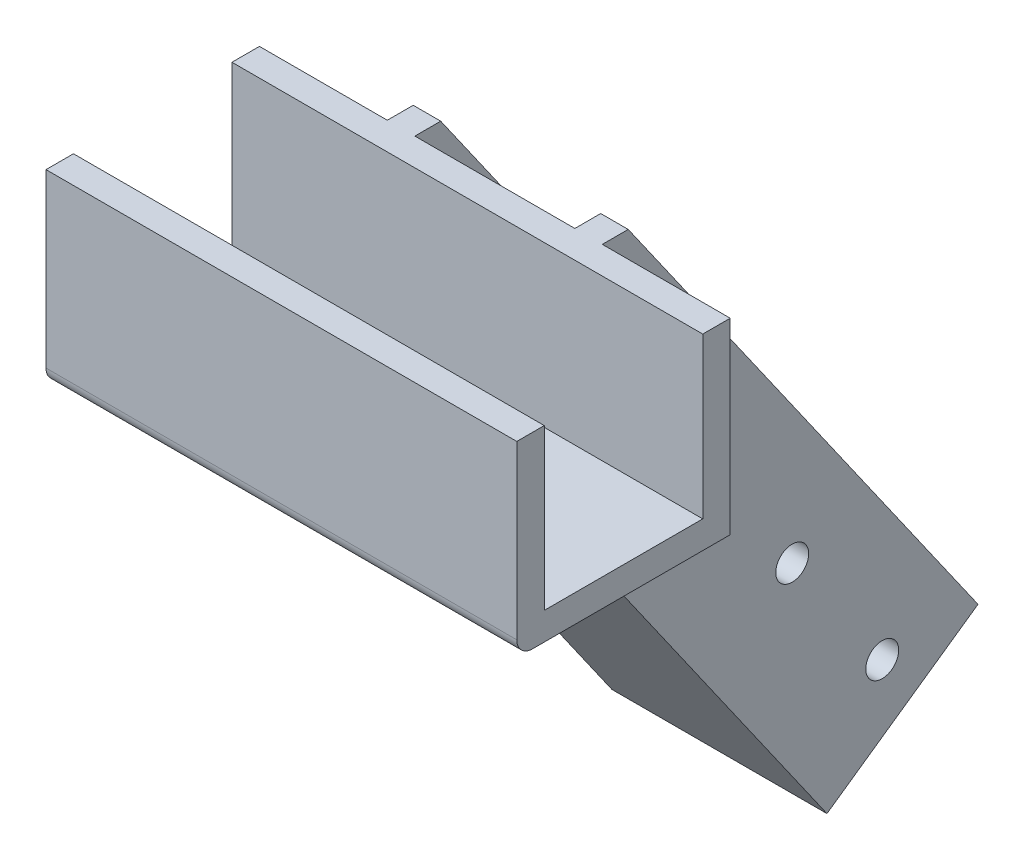
ISO-10303-21;
HEADER;
FILE_DESCRIPTION(('STEP AP214'),'2;1');
FILE_NAME('part.step','',(''),(''),'','','');
FILE_SCHEMA(('AUTOMOTIVE_DESIGN { 1 0 10303 214 1 1 1 1 }'));
ENDSEC;
DATA;
#1=APPLICATION_CONTEXT('core data for automotive mechanical design processes');
#2=APPLICATION_PROTOCOL_DEFINITION('international standard','automotive_design',2000,#1);
#3=PRODUCT_CONTEXT('',#1,'mechanical');
#4=PRODUCT('Part','Part','',(#3));
#5=PRODUCT_RELATED_PRODUCT_CATEGORY('part','',(#4));
#6=PRODUCT_DEFINITION_FORMATION('','',#4);
#7=PRODUCT_DEFINITION_CONTEXT('part definition',#1,'design');
#8=PRODUCT_DEFINITION('design','',#6,#7);
#9=PRODUCT_DEFINITION_SHAPE('','',#8);
#10=(LENGTH_UNIT() NAMED_UNIT(*) SI_UNIT(.MILLI.,.METRE.));
#11=(NAMED_UNIT(*) PLANE_ANGLE_UNIT() SI_UNIT($,.RADIAN.));
#12=(NAMED_UNIT(*) SI_UNIT($,.STERADIAN.) SOLID_ANGLE_UNIT());
#13=UNCERTAINTY_MEASURE_WITH_UNIT(LENGTH_MEASURE(1.E-05),#10,'distance_accuracy_value','');
#14=(GEOMETRIC_REPRESENTATION_CONTEXT(3) GLOBAL_UNCERTAINTY_ASSIGNED_CONTEXT((#13)) GLOBAL_UNIT_ASSIGNED_CONTEXT((#10,
#11,#12)) REPRESENTATION_CONTEXT('',''));
#15=CARTESIAN_POINT('',(0.,0.,0.));
#16=DIRECTION('',(0.,0.,1.));
#17=DIRECTION('',(1.,0.,0.));
#18=AXIS2_PLACEMENT_3D('',#15,#16,#17);
#19=CARTESIAN_POINT('',(13.7,-51.7158366245348,-61.4792987336094));
#20=DIRECTION('',(0.,-0.573576436351047,0.819152044288991));
#21=DIRECTION('',(0.,-0.819152044288991,-0.573576436351047));
#22=AXIS2_PLACEMENT_3D('',#19,#20,#21);
#23=PLANE('',#22);
#24=DIRECTION('',(0.,0.819152044288991,0.573576436351047));
#25=VECTOR('',#24,1.);
#26=CARTESIAN_POINT('',(-13.7,-51.7158366245348,-61.4792987336094));
#27=LINE('',#26,#25);
#28=CARTESIAN_POINT('',(-13.7,-51.7158366245348,-61.4792987336094));
#29=VERTEX_POINT('',#28);
#30=CARTESIAN_POINT('',(-13.7,11.95,-16.9000000026822));
#31=VERTEX_POINT('',#30);
#32=EDGE_CURVE('E197',#29,#31,#27,.T.);
#33=ORIENTED_EDGE('',*,*,#32,.T.);
#34=DIRECTION('',(1.,0.,0.));
#35=VECTOR('',#34,1.);
#36=CARTESIAN_POINT('',(13.7,11.95,-16.9000000026822));
#37=LINE('',#36,#35);
#38=CARTESIAN_POINT('',(-10.1946127968211,11.95,-16.9000000026822));
#39=VERTEX_POINT('',#38);
#40=EDGE_CURVE('E180',#31,#39,#37,.T.);
#41=ORIENTED_EDGE('',*,*,#40,.T.);
#42=DIRECTION('',(0.,0.819152044288991,0.573576436351047));
#43=VECTOR('',#42,1.);
#44=CARTESIAN_POINT('',(-10.1946127968211,-51.7158366245348,-61.4792987336094));
#45=LINE('',#44,#43);
#46=CARTESIAN_POINT('',(-10.1946127968211,-51.7158366245348,-61.4792987336094));
#47=VERTEX_POINT('',#46);
#48=EDGE_CURVE('E352',#47,#39,#45,.T.);
#49=ORIENTED_EDGE('',*,*,#48,.F.);
#50=DIRECTION('',(-1.,0.,0.));
#51=VECTOR('',#50,1.);
#52=CARTESIAN_POINT('',(13.7,-51.7158366245348,-61.4792987336094));
#53=LINE('',#52,#51);
#54=EDGE_CURVE('E204',#47,#29,#53,.T.);
#55=ORIENTED_EDGE('',*,*,#54,.T.);
#56=EDGE_LOOP('',(#33,#41,#49,#55));
#57=FACE_BOUND('',#56,.T.);
#58=ADVANCED_FACE('F33',(#57),#23,.F.);
#59=CARTESIAN_POINT('',(13.7,-65.1948828787844,-42.2292256928181));
#60=DIRECTION('',(0.,0.819152044288991,0.573576436351047));
#61=DIRECTION('',(0.,-0.573576436351047,0.819152044288991));
#62=AXIS2_PLACEMENT_3D('',#59,#60,#61);
#63=PLANE('',#62);
#64=DIRECTION('',(0.,0.573576436351047,-0.819152044288991));
#65=VECTOR('',#64,1.);
#66=CARTESIAN_POINT('',(-10.1946127968211,-65.1948828787844,-42.2292256928181));
#67=LINE('',#66,#65);
#68=CARTESIAN_POINT('',(-10.1946127968211,-63.1842753787545,-45.1006707863266));
#69=VERTEX_POINT('',#68);
#70=EDGE_CURVE('E355',#69,#47,#67,.T.);
#71=ORIENTED_EDGE('',*,*,#70,.F.);
#72=DIRECTION('',(-1.,0.,0.));
#73=VECTOR('',#72,1.);
#74=CARTESIAN_POINT('',(13.7,-63.1842753787545,-45.1006707863266));
#75=LINE('',#74,#73);
#76=CARTESIAN_POINT('',(10.1946127968211,-63.1842753787545,-45.1006707863266));
#77=VERTEX_POINT('',#76);
#78=EDGE_CURVE('E358',#77,#69,#75,.T.);
#79=ORIENTED_EDGE('',*,*,#78,.F.);
#80=DIRECTION('',(0.,0.573576436351047,-0.819152044288991));
#81=VECTOR('',#80,1.);
#82=CARTESIAN_POINT('',(10.1946127968211,-65.1948828787844,-42.2292256928181));
#83=LINE('',#82,#81);
#84=CARTESIAN_POINT('',(10.1946127968211,-51.7158366245348,-61.4792987336094));
#85=VERTEX_POINT('',#84);
#86=EDGE_CURVE('E344',#77,#85,#83,.T.);
#87=ORIENTED_EDGE('',*,*,#86,.T.);
#88=CARTESIAN_POINT('',(13.7,-51.7158366245348,-61.4792987336094));
#89=VERTEX_POINT('',#88);
#90=EDGE_CURVE('E214',#89,#85,#53,.T.);
#91=ORIENTED_EDGE('',*,*,#90,.F.);
#92=DIRECTION('',(0.,0.573576436351047,-0.819152044288991));
#93=VECTOR('',#92,1.);
#94=CARTESIAN_POINT('',(13.7,-65.1948828787844,-42.2292256928181));
#95=LINE('',#94,#93);
#96=CARTESIAN_POINT('',(13.7,-65.1948828787844,-42.2292256928181));
#97=VERTEX_POINT('',#96);
#98=EDGE_CURVE('E324',#97,#89,#95,.T.);
#99=ORIENTED_EDGE('',*,*,#98,.F.);
#100=DIRECTION('',(-1.,0.,0.));
#101=VECTOR('',#100,1.);
#102=CARTESIAN_POINT('',(13.7,-65.1948828787844,-42.2292256928181));
#103=LINE('',#102,#101);
#104=CARTESIAN_POINT('',(-13.7,-65.1948828787844,-42.2292256928181));
#105=VERTEX_POINT('',#104);
#106=EDGE_CURVE('E217',#97,#105,#103,.T.);
#107=ORIENTED_EDGE('',*,*,#106,.T.);
#108=DIRECTION('',(0.,0.573576436351047,-0.819152044288991));
#109=VECTOR('',#108,1.);
#110=CARTESIAN_POINT('',(-13.7,-65.1948828787844,-42.2292256928181));
#111=LINE('',#110,#109);
#112=EDGE_CURVE('E206',#105,#29,#111,.T.);
#113=ORIENTED_EDGE('',*,*,#112,.T.);
#114=ORIENTED_EDGE('',*,*,#54,.F.);
#115=EDGE_LOOP('',(#71,#79,#87,#91,#99,#107,#113,#114));
#116=FACE_BOUND('',#115,.T.);
#117=ADVANCED_FACE('F424',(#116),#63,.F.);
#118=DIRECTION('',(0.,0.819152044288991,0.573576436351047));
#119=VECTOR('',#118,1.);
#120=CARTESIAN_POINT('',(10.1946127968211,-51.7158366245348,-61.4792987336094));
#121=LINE('',#120,#119);
#122=CARTESIAN_POINT('',(10.1946127968211,11.95,-16.9000000026822));
#123=VERTEX_POINT('',#122);
#124=EDGE_CURVE('E347',#85,#123,#121,.T.);
#125=ORIENTED_EDGE('',*,*,#124,.T.);
#126=CARTESIAN_POINT('',(13.7,11.95,-16.9000000026822));
#127=VERTEX_POINT('',#126);
#128=EDGE_CURVE('E192',#123,#127,#37,.T.);
#129=ORIENTED_EDGE('',*,*,#128,.T.);
#130=DIRECTION('',(0.,0.819152044288991,0.573576436351047));
#131=VECTOR('',#130,1.);
#132=CARTESIAN_POINT('',(13.7,-51.7158366245348,-61.4792987336094));
#133=LINE('',#132,#131);
#134=EDGE_CURVE('E331',#89,#127,#133,.T.);
#135=ORIENTED_EDGE('',*,*,#134,.F.);
#136=ORIENTED_EDGE('',*,*,#90,.T.);
#137=EDGE_LOOP('',(#125,#129,#135,#136));
#138=FACE_BOUND('',#137,.T.);
#139=ADVANCED_FACE('F426',(#138),#23,.F.);
#140=CARTESIAN_POINT('',(30.,-11.95,-13.6));
#141=DIRECTION('',(0.,0.,1.));
#142=DIRECTION('',(1.,0.,0.));
#143=AXIS2_PLACEMENT_3D('',#140,#141,#142);
#144=PLANE('',#143);
#145=DIRECTION('',(0.,-1.,0.));
#146=VECTOR('',#145,1.);
#147=CARTESIAN_POINT('',(-13.7,-11.95,-13.6));
#148=LINE('',#147,#146);
#149=CARTESIAN_POINT('',(-13.7,11.95,-13.6));
#150=VERTEX_POINT('',#149);
#151=CARTESIAN_POINT('',(-13.7,-11.95,-13.6));
#152=VERTEX_POINT('',#151);
#153=EDGE_CURVE('E199',#150,#152,#148,.T.);
#154=ORIENTED_EDGE('',*,*,#153,.T.);
#155=DIRECTION('',(-1.,0.,0.));
#156=VECTOR('',#155,1.);
#157=CARTESIAN_POINT('',(30.,-11.95,-13.6));
#158=LINE('',#157,#156);
#159=CARTESIAN_POINT('',(-30.,-11.95,-13.6));
#160=VERTEX_POINT('',#159);
#161=EDGE_CURVE('E259',#152,#160,#158,.T.);
#162=ORIENTED_EDGE('',*,*,#161,.T.);
#163=DIRECTION('',(0.,1.,0.));
#164=VECTOR('',#163,1.);
#165=CARTESIAN_POINT('',(-30.,-11.95,-13.6));
#166=LINE('',#165,#164);
#167=CARTESIAN_POINT('',(-30.,11.95,-13.6));
#168=VERTEX_POINT('',#167);
#169=EDGE_CURVE('E245',#160,#168,#166,.T.);
#170=ORIENTED_EDGE('',*,*,#169,.T.);
#171=DIRECTION('',(-1.,0.,0.));
#172=VECTOR('',#171,1.);
#173=CARTESIAN_POINT('',(30.,11.95,-13.6));
#174=LINE('',#173,#172);
#175=EDGE_CURVE('E276',#150,#168,#174,.T.);
#176=ORIENTED_EDGE('',*,*,#175,.F.);
#177=EDGE_LOOP('',(#154,#162,#170,#176));
#178=FACE_BOUND('',#177,.T.);
#179=ADVANCED_FACE('F435',(#178),#144,.F.);
#180=CARTESIAN_POINT('',(30.,11.95,13.6));
#181=DIRECTION('',(0.,-1.,0.));
#182=DIRECTION('',(0.,0.,-1.));
#183=AXIS2_PLACEMENT_3D('',#180,#181,#182);
#184=PLANE('',#183);
#185=CARTESIAN_POINT('',(30.,11.95,-13.6));
#186=VERTEX_POINT('',#185);
#187=CARTESIAN_POINT('',(13.7,11.95,-13.6));
#188=VERTEX_POINT('',#187);
#189=EDGE_CURVE('E277',#186,#188,#174,.T.);
#190=ORIENTED_EDGE('',*,*,#189,.T.);
#191=DIRECTION('',(0.,0.,1.));
#192=VECTOR('',#191,1.);
#193=CARTESIAN_POINT('',(13.7,11.95,-61.4792987336094));
#194=LINE('',#193,#192);
#195=EDGE_CURVE('E201',#127,#188,#194,.T.);
#196=ORIENTED_EDGE('',*,*,#195,.F.);
#197=ORIENTED_EDGE('',*,*,#128,.F.);
#198=DIRECTION('',(0.,0.,-1.));
#199=VECTOR('',#198,1.);
#200=CARTESIAN_POINT('',(10.1946127968211,11.95,0.));
#201=LINE('',#200,#199);
#202=CARTESIAN_POINT('',(10.1946127968211,11.95,-13.6053872031789));
#203=VERTEX_POINT('',#202);
#204=EDGE_CURVE('E190',#203,#123,#201,.T.);
#205=ORIENTED_EDGE('',*,*,#204,.F.);
#206=DIRECTION('',(1.,0.,0.));
#207=VECTOR('',#206,1.);
#208=CARTESIAN_POINT('',(30.,11.95,-13.6053872031789));
#209=LINE('',#208,#207);
#210=CARTESIAN_POINT('',(-10.1946127968211,11.95,-13.6053872031789));
#211=VERTEX_POINT('',#210);
#212=EDGE_CURVE('E47',#211,#203,#209,.T.);
#213=ORIENTED_EDGE('',*,*,#212,.F.);
#214=DIRECTION('',(0.,0.,-1.));
#215=VECTOR('',#214,1.);
#216=CARTESIAN_POINT('',(-10.1946127968211,11.95,0.));
#217=LINE('',#216,#215);
#218=EDGE_CURVE('E11',#211,#39,#217,.T.);
#219=ORIENTED_EDGE('',*,*,#218,.T.);
#220=ORIENTED_EDGE('',*,*,#40,.F.);
#221=DIRECTION('',(0.,0.,1.));
#222=VECTOR('',#221,1.);
#223=CARTESIAN_POINT('',(-13.7,11.95,-61.4792987336094));
#224=LINE('',#223,#222);
#225=EDGE_CURVE('E184',#31,#150,#224,.T.);
#226=ORIENTED_EDGE('',*,*,#225,.T.);
#227=ORIENTED_EDGE('',*,*,#175,.T.);
#228=DIRECTION('',(0.,0.,1.));
#229=VECTOR('',#228,1.);
#230=CARTESIAN_POINT('',(-30.,11.95,13.6));
#231=LINE('',#230,#229);
#232=CARTESIAN_POINT('',(-30.,11.95,-10.1));
#233=VERTEX_POINT('',#232);
#234=EDGE_CURVE('E263',#168,#233,#231,.T.);
#235=ORIENTED_EDGE('',*,*,#234,.T.);
#236=DIRECTION('',(-1.,0.,0.));
#237=VECTOR('',#236,1.);
#238=CARTESIAN_POINT('',(30.,11.95,-10.1));
#239=LINE('',#238,#237);
#240=CARTESIAN_POINT('',(30.,11.95,-10.1));
#241=VERTEX_POINT('',#240);
#242=EDGE_CURVE('E239',#241,#233,#239,.T.);
#243=ORIENTED_EDGE('',*,*,#242,.F.);
#244=DIRECTION('',(0.,0.,1.));
#245=VECTOR('',#244,1.);
#246=CARTESIAN_POINT('',(30.,11.95,13.6));
#247=LINE('',#246,#245);
#248=EDGE_CURVE('E251',#186,#241,#247,.T.);
#249=ORIENTED_EDGE('',*,*,#248,.F.);
#250=EDGE_LOOP('',(#190,#196,#197,#205,#213,#219,#220,#226,#227,#235,#243,#249));
#251=FACE_BOUND('',#250,.T.);
#252=ADVANCED_FACE('F183',(#251),#184,.F.);
#253=CARTESIAN_POINT('',(30.,0.,0.));
#254=DIRECTION('',(-1.,0.,0.));
#255=DIRECTION('',(0.,0.,1.));
#256=AXIS2_PLACEMENT_3D('',#253,#254,#255);
#257=PLANE('',#256);
#258=DIRECTION('',(0.,-1.,0.));
#259=VECTOR('',#258,1.);
#260=CARTESIAN_POINT('',(30.,-11.95,13.6));
#261=LINE('',#260,#259);
#262=CARTESIAN_POINT('',(30.,11.95,13.6));
#263=VERTEX_POINT('',#262);
#264=CARTESIAN_POINT('',(30.,-9.95,13.6));
#265=VERTEX_POINT('',#264);
#266=EDGE_CURVE('E254',#263,#265,#261,.T.);
#267=ORIENTED_EDGE('',*,*,#266,.T.);
#268=CARTESIAN_POINT('',(30.,-9.95,11.6));
#269=DIRECTION('',(-1.,0.,0.));
#270=DIRECTION('',(0.,0.,1.));
#271=AXIS2_PLACEMENT_3D('',#268,#269,#270);
#272=CIRCLE('',#271,2.);
#273=CARTESIAN_POINT('',(30.,-11.95,11.6));
#274=VERTEX_POINT('',#273);
#275=EDGE_CURVE('E286',#265,#274,#272,.F.);
#276=ORIENTED_EDGE('',*,*,#275,.T.);
#277=DIRECTION('',(0.,0.,-1.));
#278=VECTOR('',#277,1.);
#279=CARTESIAN_POINT('',(30.,-11.95,13.6));
#280=LINE('',#279,#278);
#281=CARTESIAN_POINT('',(30.,-11.95,-13.6));
#282=VERTEX_POINT('',#281);
#283=EDGE_CURVE('E257',#274,#282,#280,.T.);
#284=ORIENTED_EDGE('',*,*,#283,.T.);
#285=DIRECTION('',(0.,1.,0.));
#286=VECTOR('',#285,1.);
#287=CARTESIAN_POINT('',(30.,-11.95,-13.6));
#288=LINE('',#287,#286);
#289=EDGE_CURVE('E246',#282,#186,#288,.T.);
#290=ORIENTED_EDGE('',*,*,#289,.T.);
#291=ORIENTED_EDGE('',*,*,#248,.T.);
#292=DIRECTION('',(0.,1.,0.));
#293=VECTOR('',#292,1.);
#294=CARTESIAN_POINT('',(30.,0.,-10.1));
#295=LINE('',#294,#293);
#296=CARTESIAN_POINT('',(30.,-8.45,-10.1));
#297=VERTEX_POINT('',#296);
#298=EDGE_CURVE('E234',#297,#241,#295,.T.);
#299=ORIENTED_EDGE('',*,*,#298,.F.);
#300=DIRECTION('',(0.,0.,-1.));
#301=VECTOR('',#300,1.);
#302=CARTESIAN_POINT('',(30.,-8.45,0.));
#303=LINE('',#302,#301);
#304=CARTESIAN_POINT('',(30.,-8.45,10.1));
#305=VERTEX_POINT('',#304);
#306=EDGE_CURVE('E224',#305,#297,#303,.T.);
#307=ORIENTED_EDGE('',*,*,#306,.F.);
#308=DIRECTION('',(0.,-1.,0.));
#309=VECTOR('',#308,1.);
#310=CARTESIAN_POINT('',(30.,0.,10.1));
#311=LINE('',#310,#309);
#312=CARTESIAN_POINT('',(30.,11.95,10.1));
#313=VERTEX_POINT('',#312);
#314=EDGE_CURVE('E240',#313,#305,#311,.T.);
#315=ORIENTED_EDGE('',*,*,#314,.F.);
#316=EDGE_CURVE('E249',#313,#263,#247,.T.);
#317=ORIENTED_EDGE('',*,*,#316,.T.);
#318=EDGE_LOOP('',(#267,#276,#284,#290,#291,#299,#307,#315,#317));
#319=FACE_BOUND('',#318,.T.);
#320=ADVANCED_FACE('F402',(#319),#257,.F.);
#321=CARTESIAN_POINT('',(-30.,0.,0.));
#322=DIRECTION('',(-1.,0.,0.));
#323=DIRECTION('',(0.,0.,1.));
#324=AXIS2_PLACEMENT_3D('',#321,#322,#323);
#325=PLANE('',#324);
#326=DIRECTION('',(0.,0.,-1.));
#327=VECTOR('',#326,1.);
#328=CARTESIAN_POINT('',(-30.,-11.95,13.6));
#329=LINE('',#328,#327);
#330=CARTESIAN_POINT('',(-30.,-11.95,11.6));
#331=VERTEX_POINT('',#330);
#332=EDGE_CURVE('E250',#331,#160,#329,.T.);
#333=ORIENTED_EDGE('',*,*,#332,.F.);
#334=CARTESIAN_POINT('',(-30.,-9.95,11.6));
#335=DIRECTION('',(-1.,0.,0.));
#336=DIRECTION('',(0.,0.,1.));
#337=AXIS2_PLACEMENT_3D('',#334,#335,#336);
#338=CIRCLE('',#337,2.);
#339=CARTESIAN_POINT('',(-30.,-9.95,13.6));
#340=VERTEX_POINT('',#339);
#341=EDGE_CURVE('E282',#331,#340,#338,.T.);
#342=ORIENTED_EDGE('',*,*,#341,.T.);
#343=DIRECTION('',(0.,-1.,0.));
#344=VECTOR('',#343,1.);
#345=CARTESIAN_POINT('',(-30.,-11.95,13.6));
#346=LINE('',#345,#344);
#347=CARTESIAN_POINT('',(-30.,11.95,13.6));
#348=VERTEX_POINT('',#347);
#349=EDGE_CURVE('E266',#348,#340,#346,.T.);
#350=ORIENTED_EDGE('',*,*,#349,.F.);
#351=CARTESIAN_POINT('',(-30.,11.95,10.1));
#352=VERTEX_POINT('',#351);
#353=EDGE_CURVE('E262',#352,#348,#231,.T.);
#354=ORIENTED_EDGE('',*,*,#353,.F.);
#355=DIRECTION('',(0.,-1.,0.));
#356=VECTOR('',#355,1.);
#357=CARTESIAN_POINT('',(-30.,0.,10.1));
#358=LINE('',#357,#356);
#359=CARTESIAN_POINT('',(-30.,-8.45,10.1));
#360=VERTEX_POINT('',#359);
#361=EDGE_CURVE('E230',#352,#360,#358,.T.);
#362=ORIENTED_EDGE('',*,*,#361,.T.);
#363=DIRECTION('',(0.,0.,-1.));
#364=VECTOR('',#363,1.);
#365=CARTESIAN_POINT('',(-30.,-8.45,0.));
#366=LINE('',#365,#364);
#367=CARTESIAN_POINT('',(-30.,-8.45,-10.1));
#368=VERTEX_POINT('',#367);
#369=EDGE_CURVE('E231',#360,#368,#366,.T.);
#370=ORIENTED_EDGE('',*,*,#369,.T.);
#371=DIRECTION('',(0.,1.,0.));
#372=VECTOR('',#371,1.);
#373=CARTESIAN_POINT('',(-30.,0.,-10.1));
#374=LINE('',#373,#372);
#375=EDGE_CURVE('E220',#368,#233,#374,.T.);
#376=ORIENTED_EDGE('',*,*,#375,.T.);
#377=ORIENTED_EDGE('',*,*,#234,.F.);
#378=ORIENTED_EDGE('',*,*,#169,.F.);
#379=EDGE_LOOP('',(#333,#342,#350,#354,#362,#370,#376,#377,#378));
#380=FACE_BOUND('',#379,.T.);
#381=ADVANCED_FACE('F577',(#380),#325,.T.);
#382=CARTESIAN_POINT('',(13.7,-11.95,-13.6));
#383=VERTEX_POINT('',#382);
#384=EDGE_CURVE('E270',#282,#383,#158,.T.);
#385=ORIENTED_EDGE('',*,*,#384,.T.);
#386=DIRECTION('',(0.,-1.,0.));
#387=VECTOR('',#386,1.);
#388=CARTESIAN_POINT('',(13.7,-11.95,-13.6));
#389=LINE('',#388,#387);
#390=EDGE_CURVE('E329',#188,#383,#389,.T.);
#391=ORIENTED_EDGE('',*,*,#390,.F.);
#392=ORIENTED_EDGE('',*,*,#189,.F.);
#393=ORIENTED_EDGE('',*,*,#289,.F.);
#394=EDGE_LOOP('',(#385,#391,#392,#393));
#395=FACE_BOUND('',#394,.T.);
#396=ADVANCED_FACE('F396',(#395),#144,.F.);
#397=ORIENTED_EDGE('',*,*,#316,.F.);
#398=DIRECTION('',(-1.,0.,0.));
#399=VECTOR('',#398,1.);
#400=CARTESIAN_POINT('',(30.,11.95,10.1));
#401=LINE('',#400,#399);
#402=EDGE_CURVE('E227',#313,#352,#401,.T.);
#403=ORIENTED_EDGE('',*,*,#402,.T.);
#404=ORIENTED_EDGE('',*,*,#353,.T.);
#405=DIRECTION('',(-1.,0.,0.));
#406=VECTOR('',#405,1.);
#407=CARTESIAN_POINT('',(30.,11.95,13.6));
#408=LINE('',#407,#406);
#409=EDGE_CURVE('E273',#263,#348,#408,.T.);
#410=ORIENTED_EDGE('',*,*,#409,.F.);
#411=EDGE_LOOP('',(#397,#403,#404,#410));
#412=FACE_BOUND('',#411,.T.);
#413=ADVANCED_FACE('F419',(#412),#184,.F.);
#414=CARTESIAN_POINT('',(30.,-11.95,13.6));
#415=DIRECTION('',(0.,0.,-1.));
#416=DIRECTION('',(-1.,0.,0.));
#417=AXIS2_PLACEMENT_3D('',#414,#415,#416);
#418=PLANE('',#417);
#419=ORIENTED_EDGE('',*,*,#349,.T.);
#420=DIRECTION('',(-1.,0.,0.));
#421=VECTOR('',#420,1.);
#422=CARTESIAN_POINT('',(30.,-9.95,13.6));
#423=LINE('',#422,#421);
#424=EDGE_CURVE('E284',#340,#265,#423,.F.);
#425=ORIENTED_EDGE('',*,*,#424,.T.);
#426=ORIENTED_EDGE('',*,*,#266,.F.);
#427=ORIENTED_EDGE('',*,*,#409,.T.);
#428=EDGE_LOOP('',(#419,#425,#426,#427));
#429=FACE_BOUND('',#428,.T.);
#430=ADVANCED_FACE('F409',(#429),#418,.F.);
#431=CARTESIAN_POINT('',(30.,-11.95,13.6));
#432=DIRECTION('',(0.,1.,0.));
#433=DIRECTION('',(0.,0.,1.));
#434=AXIS2_PLACEMENT_3D('',#431,#432,#433);
#435=PLANE('',#434);
#436=DIRECTION('',(0.,0.,1.));
#437=VECTOR('',#436,1.);
#438=CARTESIAN_POINT('',(-13.7,-11.95,-4.94675733000001));
#439=LINE('',#438,#437);
#440=CARTESIAN_POINT('',(-13.7,-11.95,0.258913175517446));
#441=VERTEX_POINT('',#440);
#442=EDGE_CURVE('E55',#152,#441,#439,.T.);
#443=ORIENTED_EDGE('',*,*,#442,.T.);
#444=DIRECTION('',(-1.,0.,0.));
#445=VECTOR('',#444,1.);
#446=CARTESIAN_POINT('',(13.7,-11.95,0.258913175517446));
#447=LINE('',#446,#445);
#448=CARTESIAN_POINT('',(13.7,-11.95,0.258913175517446));
#449=VERTEX_POINT('',#448);
#450=EDGE_CURVE('E306',#441,#449,#447,.F.);
#451=ORIENTED_EDGE('',*,*,#450,.T.);
#452=DIRECTION('',(0.,0.,1.));
#453=VECTOR('',#452,1.);
#454=CARTESIAN_POINT('',(13.7,-11.95,-4.94675733000001));
#455=LINE('',#454,#453);
#456=EDGE_CURVE('E208',#383,#449,#455,.T.);
#457=ORIENTED_EDGE('',*,*,#456,.F.);
#458=ORIENTED_EDGE('',*,*,#384,.F.);
#459=ORIENTED_EDGE('',*,*,#283,.F.);
#460=DIRECTION('',(-1.,0.,0.));
#461=VECTOR('',#460,1.);
#462=CARTESIAN_POINT('',(30.,-11.95,11.6));
#463=LINE('',#462,#461);
#464=EDGE_CURVE('E279',#274,#331,#463,.T.);
#465=ORIENTED_EDGE('',*,*,#464,.T.);
#466=ORIENTED_EDGE('',*,*,#332,.T.);
#467=ORIENTED_EDGE('',*,*,#161,.F.);
#468=EDGE_LOOP('',(#443,#451,#457,#458,#459,#465,#466,#467));
#469=FACE_BOUND('',#468,.T.);
#470=ADVANCED_FACE('F406',(#469),#435,.F.);
#471=CARTESIAN_POINT('',(30.,-11.95,-10.1));
#472=DIRECTION('',(0.,0.,1.));
#473=DIRECTION('',(1.,0.,0.));
#474=AXIS2_PLACEMENT_3D('',#471,#472,#473);
#475=PLANE('',#474);
#476=ORIENTED_EDGE('',*,*,#242,.T.);
#477=ORIENTED_EDGE('',*,*,#375,.F.);
#478=DIRECTION('',(-1.,0.,0.));
#479=VECTOR('',#478,1.);
#480=CARTESIAN_POINT('',(30.,-8.45,-10.1));
#481=LINE('',#480,#479);
#482=EDGE_CURVE('E221',#297,#368,#481,.T.);
#483=ORIENTED_EDGE('',*,*,#482,.F.);
#484=ORIENTED_EDGE('',*,*,#298,.T.);
#485=EDGE_LOOP('',(#476,#477,#483,#484));
#486=FACE_BOUND('',#485,.T.);
#487=ADVANCED_FACE('F408',(#486),#475,.T.);
#488=CARTESIAN_POINT('',(30.,-11.95,10.1));
#489=DIRECTION('',(0.,0.,-1.));
#490=DIRECTION('',(-1.,0.,0.));
#491=AXIS2_PLACEMENT_3D('',#488,#489,#490);
#492=PLANE('',#491);
#493=ORIENTED_EDGE('',*,*,#361,.F.);
#494=ORIENTED_EDGE('',*,*,#402,.F.);
#495=ORIENTED_EDGE('',*,*,#314,.T.);
#496=DIRECTION('',(-1.,0.,0.));
#497=VECTOR('',#496,1.);
#498=CARTESIAN_POINT('',(30.,-8.45,10.1));
#499=LINE('',#498,#497);
#500=EDGE_CURVE('E223',#305,#360,#499,.T.);
#501=ORIENTED_EDGE('',*,*,#500,.T.);
#502=EDGE_LOOP('',(#493,#494,#495,#501));
#503=FACE_BOUND('',#502,.T.);
#504=ADVANCED_FACE('F416',(#503),#492,.T.);
#505=CARTESIAN_POINT('',(30.,-8.45,13.6));
#506=DIRECTION('',(0.,1.,0.));
#507=DIRECTION('',(0.,0.,1.));
#508=AXIS2_PLACEMENT_3D('',#505,#506,#507);
#509=PLANE('',#508);
#510=ORIENTED_EDGE('',*,*,#369,.F.);
#511=ORIENTED_EDGE('',*,*,#500,.F.);
#512=ORIENTED_EDGE('',*,*,#306,.T.);
#513=ORIENTED_EDGE('',*,*,#482,.T.);
#514=EDGE_LOOP('',(#510,#511,#512,#513));
#515=FACE_BOUND('',#514,.T.);
#516=ADVANCED_FACE('F621',(#515),#509,.T.);
#517=CARTESIAN_POINT('',(13.7,-11.95,-4.94675733000001));
#518=DIRECTION('',(0.,0.573576436351047,-0.819152044288991));
#519=DIRECTION('',(0.,0.819152044288991,0.573576436351047));
#520=AXIS2_PLACEMENT_3D('',#517,#518,#519);
#521=PLANE('',#520);
#522=DIRECTION('',(0.,-0.819152044288991,-0.573576436351047));
#523=VECTOR('',#522,1.);
#524=CARTESIAN_POINT('',(13.7,-11.95,-4.94675733000001));
#525=LINE('',#524,#523);
#526=CARTESIAN_POINT('',(13.7,-16.2142356364895,-7.93260726737246));
#527=VERTEX_POINT('',#526);
#528=EDGE_CURVE('E314',#527,#97,#525,.T.);
#529=ORIENTED_EDGE('',*,*,#528,.F.);
#530=DIRECTION('',(-1.,0.,0.));
#531=VECTOR('',#530,1.);
#532=CARTESIAN_POINT('',(-13.7,-16.2142356364895,-7.93260726737246));
#533=LINE('',#532,#531);
#534=CARTESIAN_POINT('',(-13.7,-16.2142356364895,-7.93260726737246));
#535=VERTEX_POINT('',#534);
#536=EDGE_CURVE('E288',#527,#535,#533,.T.);
#537=ORIENTED_EDGE('',*,*,#536,.T.);
#538=DIRECTION('',(0.,-0.819152044288991,-0.573576436351047));
#539=VECTOR('',#538,1.);
#540=CARTESIAN_POINT('',(-13.7,-11.95,-4.94675733000001));
#541=LINE('',#540,#539);
#542=EDGE_CURVE('E210',#535,#105,#541,.T.);
#543=ORIENTED_EDGE('',*,*,#542,.T.);
#544=ORIENTED_EDGE('',*,*,#106,.F.);
#545=EDGE_LOOP('',(#529,#537,#543,#544));
#546=FACE_BOUND('',#545,.T.);
#547=ADVANCED_FACE('F321',(#546),#521,.F.);
#548=CARTESIAN_POINT('',(13.7,0.,0.));
#549=DIRECTION('',(1.,0.,0.));
#550=DIRECTION('',(0.,0.,-1.));
#551=AXIS2_PLACEMENT_3D('',#548,#549,#550);
#552=PLANE('',#551);
#553=ORIENTED_EDGE('',*,*,#195,.T.);
#554=ORIENTED_EDGE('',*,*,#390,.T.);
#555=ORIENTED_EDGE('',*,*,#456,.T.);
#556=CARTESIAN_POINT('',(13.7,-21.95,0.258913175517446));
#557=DIRECTION('',(1.,0.,0.));
#558=DIRECTION('',(0.,0.,-1.));
#559=AXIS2_PLACEMENT_3D('',#556,#557,#558);
#560=CIRCLE('',#559,10.);
#561=EDGE_CURVE('E41',#449,#527,#560,.F.);
#562=ORIENTED_EDGE('',*,*,#561,.T.);
#563=ORIENTED_EDGE('',*,*,#528,.T.);
#564=ORIENTED_EDGE('',*,*,#98,.T.);
#565=ORIENTED_EDGE('',*,*,#134,.T.);
#566=EDGE_LOOP('',(#553,#554,#555,#562,#563,#564,#565));
#567=FACE_BOUND('',#566,.T.);
#568=CARTESIAN_POINT('',(13.7,-51.7175366780223,-49.2727432362621));
#569=DIRECTION('',(1.,0.,0.));
#570=DIRECTION('',(0.,0.,-1.));
#571=AXIS2_PLACEMENT_3D('',#568,#569,#570);
#572=CIRCLE('',#571,2.09999999999999);
#573=CARTESIAN_POINT('',(13.7,-51.7175366780223,-51.3727432362621));
#574=VERTEX_POINT('',#573);
#575=EDGE_CURVE('E293',#574,#574,#572,.T.);
#576=ORIENTED_EDGE('',*,*,#575,.F.);
#577=EDGE_LOOP('',(#576));
#578=FACE_BOUND('',#577,.T.);
#579=CARTESIAN_POINT('',(13.7,-35.3344957922425,-37.8012145092412));
#580=DIRECTION('',(1.,0.,0.));
#581=DIRECTION('',(0.,0.,-1.));
#582=AXIS2_PLACEMENT_3D('',#579,#580,#581);
#583=CIRCLE('',#582,2.09999999999999);
#584=CARTESIAN_POINT('',(13.7,-35.3344957922425,-39.9012145092412));
#585=VERTEX_POINT('',#584);
#586=EDGE_CURVE('E383',#585,#585,#583,.T.);
#587=ORIENTED_EDGE('',*,*,#586,.F.);
#588=EDGE_LOOP('',(#587));
#589=FACE_BOUND('',#588,.T.);
#590=CARTESIAN_POINT('',(13.7,-18.9514549064627,-26.3296857822202));
#591=DIRECTION('',(1.,0.,0.));
#592=DIRECTION('',(0.,0.,-1.));
#593=AXIS2_PLACEMENT_3D('',#590,#591,#592);
#594=CIRCLE('',#593,2.1);
#595=CARTESIAN_POINT('',(13.7,-18.9514549064627,-28.4296857822202));
#596=VERTEX_POINT('',#595);
#597=EDGE_CURVE('E380',#596,#596,#594,.T.);
#598=ORIENTED_EDGE('',*,*,#597,.F.);
#599=EDGE_LOOP('',(#598));
#600=FACE_BOUND('',#599,.T.);
#601=ADVANCED_FACE('F312',(#567,#578,#589,#600),#552,.T.);
#602=CARTESIAN_POINT('',(-13.7,0.,0.));
#603=DIRECTION('',(1.,0.,0.));
#604=DIRECTION('',(0.,0.,-1.));
#605=AXIS2_PLACEMENT_3D('',#602,#603,#604);
#606=PLANE('',#605);
#607=CARTESIAN_POINT('',(-13.7,-51.7175366780223,-49.2727432362621));
#608=DIRECTION('',(1.,0.,0.));
#609=DIRECTION('',(0.,0.,-1.));
#610=AXIS2_PLACEMENT_3D('',#607,#608,#609);
#611=CIRCLE('',#610,2.09999999999999);
#612=CARTESIAN_POINT('',(-13.7,-51.7175366780223,-51.3727432362621));
#613=VERTEX_POINT('',#612);
#614=EDGE_CURVE('E367',#613,#613,#611,.T.);
#615=ORIENTED_EDGE('',*,*,#614,.T.);
#616=EDGE_LOOP('',(#615));
#617=FACE_BOUND('',#616,.T.);
#618=CARTESIAN_POINT('',(-13.7,-35.3344957922425,-37.8012145092412));
#619=DIRECTION('',(1.,0.,0.));
#620=DIRECTION('',(0.,0.,-1.));
#621=AXIS2_PLACEMENT_3D('',#618,#619,#620);
#622=CIRCLE('',#621,2.09999999999999);
#623=CARTESIAN_POINT('',(-13.7,-35.3344957922425,-39.9012145092412));
#624=VERTEX_POINT('',#623);
#625=EDGE_CURVE('E303',#624,#624,#622,.T.);
#626=ORIENTED_EDGE('',*,*,#625,.T.);
#627=EDGE_LOOP('',(#626));
#628=FACE_BOUND('',#627,.T.);
#629=CARTESIAN_POINT('',(-13.7,-18.9514549064627,-26.3296857822202));
#630=DIRECTION('',(1.,0.,0.));
#631=DIRECTION('',(0.,0.,-1.));
#632=AXIS2_PLACEMENT_3D('',#629,#630,#631);
#633=CIRCLE('',#632,2.1);
#634=CARTESIAN_POINT('',(-13.7,-18.9514549064627,-28.4296857822202));
#635=VERTEX_POINT('',#634);
#636=EDGE_CURVE('E298',#635,#635,#633,.T.);
#637=ORIENTED_EDGE('',*,*,#636,.T.);
#638=EDGE_LOOP('',(#637));
#639=FACE_BOUND('',#638,.T.);
#640=ORIENTED_EDGE('',*,*,#153,.F.);
#641=ORIENTED_EDGE('',*,*,#225,.F.);
#642=ORIENTED_EDGE('',*,*,#32,.F.);
#643=ORIENTED_EDGE('',*,*,#112,.F.);
#644=ORIENTED_EDGE('',*,*,#542,.F.);
#645=CARTESIAN_POINT('',(-13.7,-21.95,0.258913175517446));
#646=DIRECTION('',(1.,0.,0.));
#647=DIRECTION('',(0.,0.,-1.));
#648=AXIS2_PLACEMENT_3D('',#645,#646,#647);
#649=CIRCLE('',#648,10.);
#650=EDGE_CURVE('E308',#535,#441,#649,.T.);
#651=ORIENTED_EDGE('',*,*,#650,.T.);
#652=ORIENTED_EDGE('',*,*,#442,.F.);
#653=EDGE_LOOP('',(#640,#641,#642,#643,#644,#651,#652));
#654=FACE_BOUND('',#653,.T.);
#655=ADVANCED_FACE('F195',(#617,#628,#639,#654),#606,.F.);
#656=CARTESIAN_POINT('',(30.,-11.95,-13.6053872031789));
#657=DIRECTION('',(0.,0.,1.));
#658=DIRECTION('',(1.,0.,0.));
#659=AXIS2_PLACEMENT_3D('',#656,#657,#658);
#660=PLANE('',#659);
#661=DIRECTION('',(0.,-1.,0.));
#662=VECTOR('',#661,1.);
#663=CARTESIAN_POINT('',(-10.1946127968211,0.,-13.6053872031789));
#664=LINE('',#663,#662);
#665=CARTESIAN_POINT('',(-10.1946127968211,-11.9553872031789,-13.6053872031789));
#666=VERTEX_POINT('',#665);
#667=EDGE_CURVE('E354',#211,#666,#664,.T.);
#668=ORIENTED_EDGE('',*,*,#667,.F.);
#669=ORIENTED_EDGE('',*,*,#212,.T.);
#670=DIRECTION('',(0.,-1.,0.));
#671=VECTOR('',#670,1.);
#672=CARTESIAN_POINT('',(10.1946127968211,0.,-13.6053872031789));
#673=LINE('',#672,#671);
#674=CARTESIAN_POINT('',(10.1946127968211,-11.9553872031789,-13.6053872031789));
#675=VERTEX_POINT('',#674);
#676=EDGE_CURVE('E351',#203,#675,#673,.T.);
#677=ORIENTED_EDGE('',*,*,#676,.T.);
#678=DIRECTION('',(-1.,0.,0.));
#679=VECTOR('',#678,1.);
#680=CARTESIAN_POINT('',(30.,-11.9553872031789,-13.6053872031789));
#681=LINE('',#680,#679);
#682=EDGE_CURVE('E343',#675,#666,#681,.T.);
#683=ORIENTED_EDGE('',*,*,#682,.T.);
#684=EDGE_LOOP('',(#668,#669,#677,#683));
#685=FACE_BOUND('',#684,.T.);
#686=ADVANCED_FACE('F460',(#685),#660,.F.);
#687=CARTESIAN_POINT('',(30.,-11.9553872031789,13.6));
#688=DIRECTION('',(0.,1.,0.));
#689=DIRECTION('',(0.,0.,1.));
#690=AXIS2_PLACEMENT_3D('',#687,#688,#689);
#691=PLANE('',#690);
#692=DIRECTION('',(-1.,0.,0.));
#693=VECTOR('',#692,1.);
#694=CARTESIAN_POINT('',(30.,-11.9553872031789,-9.2298171116862));
#695=LINE('',#694,#693);
#696=CARTESIAN_POINT('',(10.1946127968211,-11.9553872031789,-9.22981711168619));
#697=VERTEX_POINT('',#696);
#698=CARTESIAN_POINT('',(-10.1946127968211,-11.9553872031789,-9.22981711168619));
#699=VERTEX_POINT('',#698);
#700=EDGE_CURVE('E326',#697,#699,#695,.T.);
#701=ORIENTED_EDGE('',*,*,#700,.T.);
#702=DIRECTION('',(0.,0.,1.));
#703=VECTOR('',#702,1.);
#704=CARTESIAN_POINT('',(-10.1946127968211,-11.9553872031789,0.));
#705=LINE('',#704,#703);
#706=EDGE_CURVE('E341',#666,#699,#705,.T.);
#707=ORIENTED_EDGE('',*,*,#706,.F.);
#708=ORIENTED_EDGE('',*,*,#682,.F.);
#709=DIRECTION('',(0.,0.,-1.));
#710=VECTOR('',#709,1.);
#711=CARTESIAN_POINT('',(10.1946127968211,-11.9553872031789,13.6));
#712=LINE('',#711,#710);
#713=EDGE_CURVE('E338',#697,#675,#712,.T.);
#714=ORIENTED_EDGE('',*,*,#713,.F.);
#715=EDGE_LOOP('',(#701,#707,#708,#714));
#716=FACE_BOUND('',#715,.T.);
#717=ADVANCED_FACE('F457',(#716),#691,.F.);
#718=CARTESIAN_POINT('',(13.7,-9.93939249997006,-7.8182024235085));
#719=DIRECTION('',(0.,0.573576436351047,-0.819152044288991));
#720=DIRECTION('',(0.,0.819152044288991,0.573576436351047));
#721=AXIS2_PLACEMENT_3D('',#718,#719,#720);
#722=PLANE('',#721);
#723=DIRECTION('',(0.,-0.819152044288991,-0.573576436351047));
#724=VECTOR('',#723,1.);
#725=CARTESIAN_POINT('',(10.1946127968211,-9.93939249997006,-7.8182024235085));
#726=LINE('',#725,#724);
#727=EDGE_CURVE('E348',#697,#77,#726,.T.);
#728=ORIENTED_EDGE('',*,*,#727,.T.);
#729=ORIENTED_EDGE('',*,*,#78,.T.);
#730=DIRECTION('',(0.,-0.819152044288991,-0.573576436351047));
#731=VECTOR('',#730,1.);
#732=CARTESIAN_POINT('',(-10.1946127968211,-9.93939249997006,-7.8182024235085));
#733=LINE('',#732,#731);
#734=EDGE_CURVE('E357',#699,#69,#733,.T.);
#735=ORIENTED_EDGE('',*,*,#734,.F.);
#736=ORIENTED_EDGE('',*,*,#700,.F.);
#737=EDGE_LOOP('',(#728,#729,#735,#736));
#738=FACE_BOUND('',#737,.T.);
#739=ADVANCED_FACE('F452',(#738),#722,.T.);
#740=CARTESIAN_POINT('',(10.1946127968211,0.,0.));
#741=DIRECTION('',(1.,0.,0.));
#742=DIRECTION('',(0.,0.,-1.));
#743=AXIS2_PLACEMENT_3D('',#740,#741,#742);
#744=PLANE('',#743);
#745=CARTESIAN_POINT('',(10.1946127968211,-51.7175366780223,-49.2727432362621));
#746=DIRECTION('',(1.,0.,0.));
#747=DIRECTION('',(0.,0.,-1.));
#748=AXIS2_PLACEMENT_3D('',#745,#746,#747);
#749=CIRCLE('',#748,2.09999999999999);
#750=CARTESIAN_POINT('',(10.1946127968211,-51.7175366780223,-51.3727432362621));
#751=VERTEX_POINT('',#750);
#752=EDGE_CURVE('E302',#751,#751,#749,.T.);
#753=ORIENTED_EDGE('',*,*,#752,.T.);
#754=EDGE_LOOP('',(#753));
#755=FACE_BOUND('',#754,.T.);
#756=CARTESIAN_POINT('',(10.1946127968211,-35.3344957922425,-37.8012145092412));
#757=DIRECTION('',(1.,0.,0.));
#758=DIRECTION('',(0.,0.,-1.));
#759=AXIS2_PLACEMENT_3D('',#756,#757,#758);
#760=CIRCLE('',#759,2.09999999999999);
#761=CARTESIAN_POINT('',(10.1946127968211,-35.3344957922425,-39.9012145092412));
#762=VERTEX_POINT('',#761);
#763=EDGE_CURVE('E297',#762,#762,#760,.T.);
#764=ORIENTED_EDGE('',*,*,#763,.T.);
#765=EDGE_LOOP('',(#764));
#766=FACE_BOUND('',#765,.T.);
#767=CARTESIAN_POINT('',(10.1946127968211,-18.9514549064627,-26.3296857822202));
#768=DIRECTION('',(1.,0.,0.));
#769=DIRECTION('',(0.,0.,-1.));
#770=AXIS2_PLACEMENT_3D('',#767,#768,#769);
#771=CIRCLE('',#770,2.1);
#772=CARTESIAN_POINT('',(10.1946127968211,-18.9514549064627,-28.4296857822202));
#773=VERTEX_POINT('',#772);
#774=EDGE_CURVE('E292',#773,#773,#771,.T.);
#775=ORIENTED_EDGE('',*,*,#774,.T.);
#776=EDGE_LOOP('',(#775));
#777=FACE_BOUND('',#776,.T.);
#778=ORIENTED_EDGE('',*,*,#676,.F.);
#779=ORIENTED_EDGE('',*,*,#204,.T.);
#780=ORIENTED_EDGE('',*,*,#124,.F.);
#781=ORIENTED_EDGE('',*,*,#86,.F.);
#782=ORIENTED_EDGE('',*,*,#727,.F.);
#783=ORIENTED_EDGE('',*,*,#713,.T.);
#784=EDGE_LOOP('',(#778,#779,#780,#781,#782,#783));
#785=FACE_BOUND('',#784,.T.);
#786=ADVANCED_FACE('F446',(#755,#766,#777,#785),#744,.F.);
#787=CARTESIAN_POINT('',(-10.1946127968211,0.,0.));
#788=DIRECTION('',(1.,0.,0.));
#789=DIRECTION('',(0.,0.,-1.));
#790=AXIS2_PLACEMENT_3D('',#787,#788,#789);
#791=PLANE('',#790);
#792=ORIENTED_EDGE('',*,*,#218,.F.);
#793=ORIENTED_EDGE('',*,*,#667,.T.);
#794=ORIENTED_EDGE('',*,*,#706,.T.);
#795=ORIENTED_EDGE('',*,*,#734,.T.);
#796=ORIENTED_EDGE('',*,*,#70,.T.);
#797=ORIENTED_EDGE('',*,*,#48,.T.);
#798=EDGE_LOOP('',(#792,#793,#794,#795,#796,#797));
#799=FACE_BOUND('',#798,.T.);
#800=CARTESIAN_POINT('',(-10.1946127968211,-51.7175366780223,-49.2727432362621));
#801=DIRECTION('',(1.,0.,0.));
#802=DIRECTION('',(0.,0.,-1.));
#803=AXIS2_PLACEMENT_3D('',#800,#801,#802);
#804=CIRCLE('',#803,2.09999999999999);
#805=CARTESIAN_POINT('',(-10.1946127968211,-51.7175366780223,-51.3727432362621));
#806=VERTEX_POINT('',#805);
#807=EDGE_CURVE('E299',#806,#806,#804,.T.);
#808=ORIENTED_EDGE('',*,*,#807,.F.);
#809=EDGE_LOOP('',(#808));
#810=FACE_BOUND('',#809,.T.);
#811=CARTESIAN_POINT('',(-10.1946127968211,-35.3344957922425,-37.8012145092412));
#812=DIRECTION('',(1.,0.,0.));
#813=DIRECTION('',(0.,0.,-1.));
#814=AXIS2_PLACEMENT_3D('',#811,#812,#813);
#815=CIRCLE('',#814,2.09999999999999);
#816=CARTESIAN_POINT('',(-10.1946127968211,-35.3344957922425,-39.9012145092412));
#817=VERTEX_POINT('',#816);
#818=EDGE_CURVE('E294',#817,#817,#815,.T.);
#819=ORIENTED_EDGE('',*,*,#818,.F.);
#820=EDGE_LOOP('',(#819));
#821=FACE_BOUND('',#820,.T.);
#822=CARTESIAN_POINT('',(-10.1946127968211,-18.9514549064627,-26.3296857822202));
#823=DIRECTION('',(1.,0.,0.));
#824=DIRECTION('',(0.,0.,-1.));
#825=AXIS2_PLACEMENT_3D('',#822,#823,#824);
#826=CIRCLE('',#825,2.1);
#827=CARTESIAN_POINT('',(-10.1946127968211,-18.9514549064627,-28.4296857822202));
#828=VERTEX_POINT('',#827);
#829=EDGE_CURVE('E289',#828,#828,#826,.T.);
#830=ORIENTED_EDGE('',*,*,#829,.F.);
#831=EDGE_LOOP('',(#830));
#832=FACE_BOUND('',#831,.T.);
#833=ADVANCED_FACE('F462',(#799,#810,#821,#832),#791,.T.);
#834=CARTESIAN_POINT('',(30.,-9.95,11.6));
#835=DIRECTION('',(-1.,0.,0.));
#836=DIRECTION('',(0.,0.,1.));
#837=AXIS2_PLACEMENT_3D('',#834,#835,#836);
#838=CYLINDRICAL_SURFACE('',#837,2.);
#839=ORIENTED_EDGE('',*,*,#275,.F.);
#840=ORIENTED_EDGE('',*,*,#424,.F.);
#841=ORIENTED_EDGE('',*,*,#341,.F.);
#842=ORIENTED_EDGE('',*,*,#464,.F.);
#843=EDGE_LOOP('',(#839,#840,#841,#842));
#844=FACE_BOUND('',#843,.T.);
#845=ADVANCED_FACE('F465',(#844),#838,.T.);
#846=CARTESIAN_POINT('',(-30.,-18.9514549064627,-26.3296857822202));
#847=DIRECTION('',(1.,0.,0.));
#848=DIRECTION('',(0.,0.,-1.));
#849=AXIS2_PLACEMENT_3D('',#846,#847,#848);
#850=CYLINDRICAL_SURFACE('',#849,2.1);
#851=ORIENTED_EDGE('',*,*,#829,.T.);
#852=EDGE_LOOP('',(#851));
#853=FACE_BOUND('',#852,.T.);
#854=ORIENTED_EDGE('',*,*,#636,.F.);
#855=EDGE_LOOP('',(#854));
#856=FACE_BOUND('',#855,.T.);
#857=ADVANCED_FACE('F473',(#853,#856),#850,.F.);
#858=CARTESIAN_POINT('',(-30.,-35.3344957922425,-37.8012145092412));
#859=DIRECTION('',(1.,0.,0.));
#860=DIRECTION('',(0.,0.,-1.));
#861=AXIS2_PLACEMENT_3D('',#858,#859,#860);
#862=CYLINDRICAL_SURFACE('',#861,2.09999999999999);
#863=ORIENTED_EDGE('',*,*,#818,.T.);
#864=EDGE_LOOP('',(#863));
#865=FACE_BOUND('',#864,.T.);
#866=ORIENTED_EDGE('',*,*,#625,.F.);
#867=EDGE_LOOP('',(#866));
#868=FACE_BOUND('',#867,.T.);
#869=ADVANCED_FACE('F476',(#865,#868),#862,.F.);
#870=CARTESIAN_POINT('',(-30.,-51.7175366780223,-49.2727432362621));
#871=DIRECTION('',(1.,0.,0.));
#872=DIRECTION('',(0.,0.,-1.));
#873=AXIS2_PLACEMENT_3D('',#870,#871,#872);
#874=CYLINDRICAL_SURFACE('',#873,2.09999999999999);
#875=ORIENTED_EDGE('',*,*,#807,.T.);
#876=EDGE_LOOP('',(#875));
#877=FACE_BOUND('',#876,.T.);
#878=ORIENTED_EDGE('',*,*,#614,.F.);
#879=EDGE_LOOP('',(#878));
#880=FACE_BOUND('',#879,.T.);
#881=ADVANCED_FACE('F500',(#877,#880),#874,.F.);
#882=ORIENTED_EDGE('',*,*,#597,.T.);
#883=EDGE_LOOP('',(#882));
#884=FACE_BOUND('',#883,.T.);
#885=ORIENTED_EDGE('',*,*,#774,.F.);
#886=EDGE_LOOP('',(#885));
#887=FACE_BOUND('',#886,.T.);
#888=ADVANCED_FACE('F478',(#884,#887),#850,.F.);
#889=ORIENTED_EDGE('',*,*,#586,.T.);
#890=EDGE_LOOP('',(#889));
#891=FACE_BOUND('',#890,.T.);
#892=ORIENTED_EDGE('',*,*,#763,.F.);
#893=EDGE_LOOP('',(#892));
#894=FACE_BOUND('',#893,.T.);
#895=ADVANCED_FACE('F502',(#891,#894),#862,.F.);
#896=ORIENTED_EDGE('',*,*,#575,.T.);
#897=EDGE_LOOP('',(#896));
#898=FACE_BOUND('',#897,.T.);
#899=ORIENTED_EDGE('',*,*,#752,.F.);
#900=EDGE_LOOP('',(#899));
#901=FACE_BOUND('',#900,.T.);
#902=ADVANCED_FACE('F505',(#898,#901),#874,.F.);
#903=CARTESIAN_POINT('',(13.7,-21.95,0.258913175517446));
#904=DIRECTION('',(1.,0.,0.));
#905=DIRECTION('',(0.,0.,-1.));
#906=AXIS2_PLACEMENT_3D('',#903,#904,#905);
#907=CYLINDRICAL_SURFACE('',#906,10.);
#908=ORIENTED_EDGE('',*,*,#561,.F.);
#909=ORIENTED_EDGE('',*,*,#450,.F.);
#910=ORIENTED_EDGE('',*,*,#650,.F.);
#911=ORIENTED_EDGE('',*,*,#536,.F.);
#912=EDGE_LOOP('',(#908,#909,#910,#911));
#913=FACE_BOUND('',#912,.T.);
#914=ADVANCED_FACE('F35',(#913),#907,.F.);
#915=CLOSED_SHELL('',(#58,#117,#139,#179,#252,#320,#381,#396,#413,#430,#470,#487,#504,#516,#547,
#601,#655,#686,#717,#739,#786,#833,#845,#857,#869,#881,#888,#895,#902,#914));
#916=MANIFOLD_SOLID_BREP('B2',#915);
#917=ADVANCED_BREP_SHAPE_REPRESENTATION('',(#18,#916),#14);
#918=SHAPE_DEFINITION_REPRESENTATION(#9,#917);
ENDSEC;
END-ISO-10303-21;
